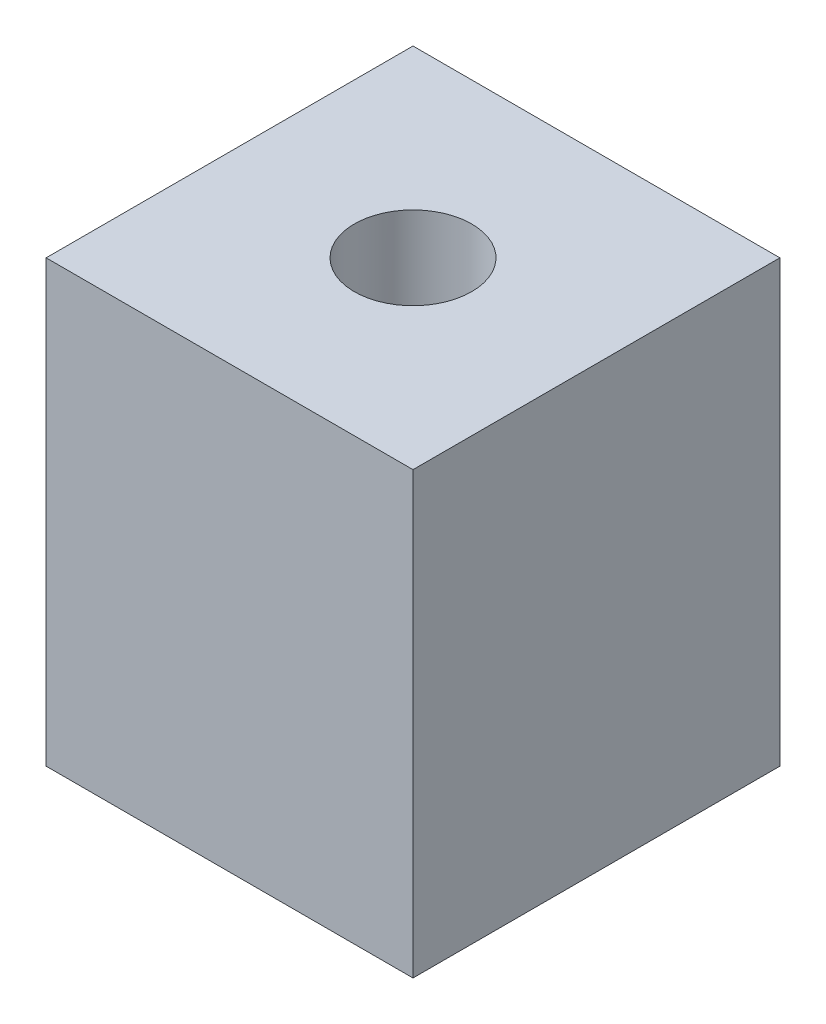
ISO-10303-21;
HEADER;
FILE_DESCRIPTION(('STEP AP214'),'2;1');
FILE_NAME('part.step','',(''),(''),'','','');
FILE_SCHEMA(('AUTOMOTIVE_DESIGN { 1 0 10303 214 1 1 1 1 }'));
ENDSEC;
DATA;
#1=APPLICATION_CONTEXT('core data for automotive mechanical design processes');
#2=APPLICATION_PROTOCOL_DEFINITION('international standard','automotive_design',2000,#1);
#3=PRODUCT_CONTEXT('',#1,'mechanical');
#4=PRODUCT('Part','Part','',(#3));
#5=PRODUCT_RELATED_PRODUCT_CATEGORY('part','',(#4));
#6=PRODUCT_DEFINITION_FORMATION('','',#4);
#7=PRODUCT_DEFINITION_CONTEXT('part definition',#1,'design');
#8=PRODUCT_DEFINITION('design','',#6,#7);
#9=PRODUCT_DEFINITION_SHAPE('','',#8);
#10=(LENGTH_UNIT() NAMED_UNIT(*) SI_UNIT(.MILLI.,.METRE.));
#11=(NAMED_UNIT(*) PLANE_ANGLE_UNIT() SI_UNIT($,.RADIAN.));
#12=(NAMED_UNIT(*) SI_UNIT($,.STERADIAN.) SOLID_ANGLE_UNIT());
#13=UNCERTAINTY_MEASURE_WITH_UNIT(LENGTH_MEASURE(1.E-05),#10,'distance_accuracy_value','');
#14=(GEOMETRIC_REPRESENTATION_CONTEXT(3) GLOBAL_UNCERTAINTY_ASSIGNED_CONTEXT((#13)) GLOBAL_UNIT_ASSIGNED_CONTEXT((#10,
#11,#12)) REPRESENTATION_CONTEXT('',''));
#15=CARTESIAN_POINT('',(0.,0.,0.));
#16=DIRECTION('',(0.,0.,1.));
#17=DIRECTION('',(1.,0.,0.));
#18=AXIS2_PLACEMENT_3D('',#15,#16,#17);
#19=CARTESIAN_POINT('',(0.,0.,0.));
#20=DIRECTION('',(0.,1.,0.));
#21=DIRECTION('',(1.,0.,0.));
#22=AXIS2_PLACEMENT_3D('',#19,#20,#21);
#23=PLANE('',#22);
#24=DIRECTION('',(-1.,0.,0.));
#25=VECTOR('',#24,1.);
#26=CARTESIAN_POINT('',(5.,0.,-5.));
#27=LINE('',#26,#25);
#28=CARTESIAN_POINT('',(5.,0.,-5.));
#29=VERTEX_POINT('',#28);
#30=CARTESIAN_POINT('',(-5.,0.,-5.));
#31=VERTEX_POINT('',#30);
#32=EDGE_CURVE('E80',#29,#31,#27,.T.);
#33=ORIENTED_EDGE('',*,*,#32,.F.);
#34=DIRECTION('',(0.,0.,-1.));
#35=VECTOR('',#34,1.);
#36=CARTESIAN_POINT('',(5.,0.,5.));
#37=LINE('',#36,#35);
#38=CARTESIAN_POINT('',(5.,0.,5.));
#39=VERTEX_POINT('',#38);
#40=EDGE_CURVE('E36',#39,#29,#37,.T.);
#41=ORIENTED_EDGE('',*,*,#40,.F.);
#42=DIRECTION('',(1.,0.,0.));
#43=VECTOR('',#42,1.);
#44=CARTESIAN_POINT('',(-5.,0.,5.));
#45=LINE('',#44,#43);
#46=CARTESIAN_POINT('',(-5.,0.,5.));
#47=VERTEX_POINT('',#46);
#48=EDGE_CURVE('E90',#47,#39,#45,.T.);
#49=ORIENTED_EDGE('',*,*,#48,.F.);
#50=DIRECTION('',(0.,0.,1.));
#51=VECTOR('',#50,1.);
#52=CARTESIAN_POINT('',(-5.,0.,-5.));
#53=LINE('',#52,#51);
#54=EDGE_CURVE('E82',#31,#47,#53,.T.);
#55=ORIENTED_EDGE('',*,*,#54,.F.);
#56=EDGE_LOOP('',(#33,#41,#49,#55));
#57=FACE_BOUND('',#56,.T.);
#58=CARTESIAN_POINT('',(0.,0.,0.));
#59=DIRECTION('',(0.,-1.,0.));
#60=DIRECTION('',(-1.,0.,0.));
#61=AXIS2_PLACEMENT_3D('',#58,#59,#60);
#62=CIRCLE('',#61,1.6);
#63=CARTESIAN_POINT('',(-1.6,0.,0.));
#64=VERTEX_POINT('',#63);
#65=EDGE_CURVE('E11',#64,#64,#62,.T.);
#66=ORIENTED_EDGE('',*,*,#65,.F.);
#67=EDGE_LOOP('',(#66));
#68=FACE_BOUND('',#67,.T.);
#69=ADVANCED_FACE('F17',(#57,#68),#23,.F.);
#70=CARTESIAN_POINT('',(0.,0.,0.));
#71=DIRECTION('',(0.,1.,0.));
#72=DIRECTION('',(1.,0.,0.));
#73=AXIS2_PLACEMENT_3D('',#70,#71,#72);
#74=CYLINDRICAL_SURFACE('',#73,1.6);
#75=CARTESIAN_POINT('',(0.,12.,0.));
#76=DIRECTION('',(0.,-1.,0.));
#77=DIRECTION('',(1.,0.,0.));
#78=AXIS2_PLACEMENT_3D('',#75,#76,#77);
#79=CIRCLE('',#78,1.6);
#80=CARTESIAN_POINT('',(1.6,12.,0.));
#81=VERTEX_POINT('',#80);
#82=EDGE_CURVE('E73',#81,#81,#79,.T.);
#83=ORIENTED_EDGE('',*,*,#82,.F.);
#84=EDGE_LOOP('',(#83));
#85=FACE_BOUND('',#84,.T.);
#86=ORIENTED_EDGE('',*,*,#65,.T.);
#87=EDGE_LOOP('',(#86));
#88=FACE_BOUND('',#87,.T.);
#89=ADVANCED_FACE('F106',(#85,#88),#74,.F.);
#90=CARTESIAN_POINT('',(0.,12.,0.));
#91=DIRECTION('',(0.,1.,0.));
#92=DIRECTION('',(1.,0.,0.));
#93=AXIS2_PLACEMENT_3D('',#90,#91,#92);
#94=PLANE('',#93);
#95=DIRECTION('',(1.,0.,0.));
#96=VECTOR('',#95,1.);
#97=CARTESIAN_POINT('',(-5.,12.,5.));
#98=LINE('',#97,#96);
#99=CARTESIAN_POINT('',(-5.,12.,5.));
#100=VERTEX_POINT('',#99);
#101=CARTESIAN_POINT('',(5.,12.,5.));
#102=VERTEX_POINT('',#101);
#103=EDGE_CURVE('E27',#100,#102,#98,.T.);
#104=ORIENTED_EDGE('',*,*,#103,.T.);
#105=DIRECTION('',(0.,0.,-1.));
#106=VECTOR('',#105,1.);
#107=CARTESIAN_POINT('',(5.,12.,5.));
#108=LINE('',#107,#106);
#109=CARTESIAN_POINT('',(5.,12.,-5.));
#110=VERTEX_POINT('',#109);
#111=EDGE_CURVE('E77',#102,#110,#108,.T.);
#112=ORIENTED_EDGE('',*,*,#111,.T.);
#113=DIRECTION('',(-1.,0.,0.));
#114=VECTOR('',#113,1.);
#115=CARTESIAN_POINT('',(5.,12.,-5.));
#116=LINE('',#115,#114);
#117=CARTESIAN_POINT('',(-5.,12.,-5.));
#118=VERTEX_POINT('',#117);
#119=EDGE_CURVE('E58',#110,#118,#116,.T.);
#120=ORIENTED_EDGE('',*,*,#119,.T.);
#121=DIRECTION('',(0.,0.,1.));
#122=VECTOR('',#121,1.);
#123=CARTESIAN_POINT('',(-5.,12.,-5.));
#124=LINE('',#123,#122);
#125=EDGE_CURVE('E64',#118,#100,#124,.T.);
#126=ORIENTED_EDGE('',*,*,#125,.T.);
#127=EDGE_LOOP('',(#104,#112,#120,#126));
#128=FACE_BOUND('',#127,.T.);
#129=ORIENTED_EDGE('',*,*,#82,.T.);
#130=EDGE_LOOP('',(#129));
#131=FACE_BOUND('',#130,.T.);
#132=ADVANCED_FACE('F75',(#128,#131),#94,.T.);
#133=CARTESIAN_POINT('',(-5.,0.,-5.));
#134=DIRECTION('',(-1.,0.,0.));
#135=DIRECTION('',(0.,0.,1.));
#136=AXIS2_PLACEMENT_3D('',#133,#134,#135);
#137=PLANE('',#136);
#138=DIRECTION('',(0.,1.,0.));
#139=VECTOR('',#138,1.);
#140=CARTESIAN_POINT('',(-5.,0.,5.));
#141=LINE('',#140,#139);
#142=EDGE_CURVE('E69',#47,#100,#141,.T.);
#143=ORIENTED_EDGE('',*,*,#142,.T.);
#144=ORIENTED_EDGE('',*,*,#125,.F.);
#145=DIRECTION('',(0.,1.,0.));
#146=VECTOR('',#145,1.);
#147=CARTESIAN_POINT('',(-5.,0.,-5.));
#148=LINE('',#147,#146);
#149=EDGE_CURVE('E67',#31,#118,#148,.T.);
#150=ORIENTED_EDGE('',*,*,#149,.F.);
#151=ORIENTED_EDGE('',*,*,#54,.T.);
#152=EDGE_LOOP('',(#143,#144,#150,#151));
#153=FACE_BOUND('',#152,.T.);
#154=ADVANCED_FACE('F65',(#153),#137,.T.);
#155=CARTESIAN_POINT('',(5.,0.,-5.));
#156=DIRECTION('',(0.,0.,-1.));
#157=DIRECTION('',(-1.,0.,0.));
#158=AXIS2_PLACEMENT_3D('',#155,#156,#157);
#159=PLANE('',#158);
#160=ORIENTED_EDGE('',*,*,#149,.T.);
#161=ORIENTED_EDGE('',*,*,#119,.F.);
#162=DIRECTION('',(0.,1.,0.));
#163=VECTOR('',#162,1.);
#164=CARTESIAN_POINT('',(5.,0.,-5.));
#165=LINE('',#164,#163);
#166=EDGE_CURVE('E85',#29,#110,#165,.T.);
#167=ORIENTED_EDGE('',*,*,#166,.F.);
#168=ORIENTED_EDGE('',*,*,#32,.T.);
#169=EDGE_LOOP('',(#160,#161,#167,#168));
#170=FACE_BOUND('',#169,.T.);
#171=ADVANCED_FACE('F79',(#170),#159,.T.);
#172=CARTESIAN_POINT('',(5.,0.,5.));
#173=DIRECTION('',(1.,0.,0.));
#174=DIRECTION('',(0.,0.,-1.));
#175=AXIS2_PLACEMENT_3D('',#172,#173,#174);
#176=PLANE('',#175);
#177=ORIENTED_EDGE('',*,*,#166,.T.);
#178=ORIENTED_EDGE('',*,*,#111,.F.);
#179=DIRECTION('',(0.,1.,0.));
#180=VECTOR('',#179,1.);
#181=CARTESIAN_POINT('',(5.,0.,5.));
#182=LINE('',#181,#180);
#183=EDGE_CURVE('E21',#39,#102,#182,.T.);
#184=ORIENTED_EDGE('',*,*,#183,.F.);
#185=ORIENTED_EDGE('',*,*,#40,.T.);
#186=EDGE_LOOP('',(#177,#178,#184,#185));
#187=FACE_BOUND('',#186,.T.);
#188=ADVANCED_FACE('F97',(#187),#176,.T.);
#189=CARTESIAN_POINT('',(-5.,0.,5.));
#190=DIRECTION('',(0.,0.,1.));
#191=DIRECTION('',(1.,0.,0.));
#192=AXIS2_PLACEMENT_3D('',#189,#190,#191);
#193=PLANE('',#192);
#194=ORIENTED_EDGE('',*,*,#183,.T.);
#195=ORIENTED_EDGE('',*,*,#103,.F.);
#196=ORIENTED_EDGE('',*,*,#142,.F.);
#197=ORIENTED_EDGE('',*,*,#48,.T.);
#198=EDGE_LOOP('',(#194,#195,#196,#197));
#199=FACE_BOUND('',#198,.T.);
#200=ADVANCED_FACE('F19',(#199),#193,.T.);
#201=CLOSED_SHELL('',(#69,#89,#132,#154,#171,#188,#200));
#202=MANIFOLD_SOLID_BREP('B1',#201);
#203=ADVANCED_BREP_SHAPE_REPRESENTATION('',(#18,#202),#14);
#204=SHAPE_DEFINITION_REPRESENTATION(#9,#203);
ENDSEC;
END-ISO-10303-21;
